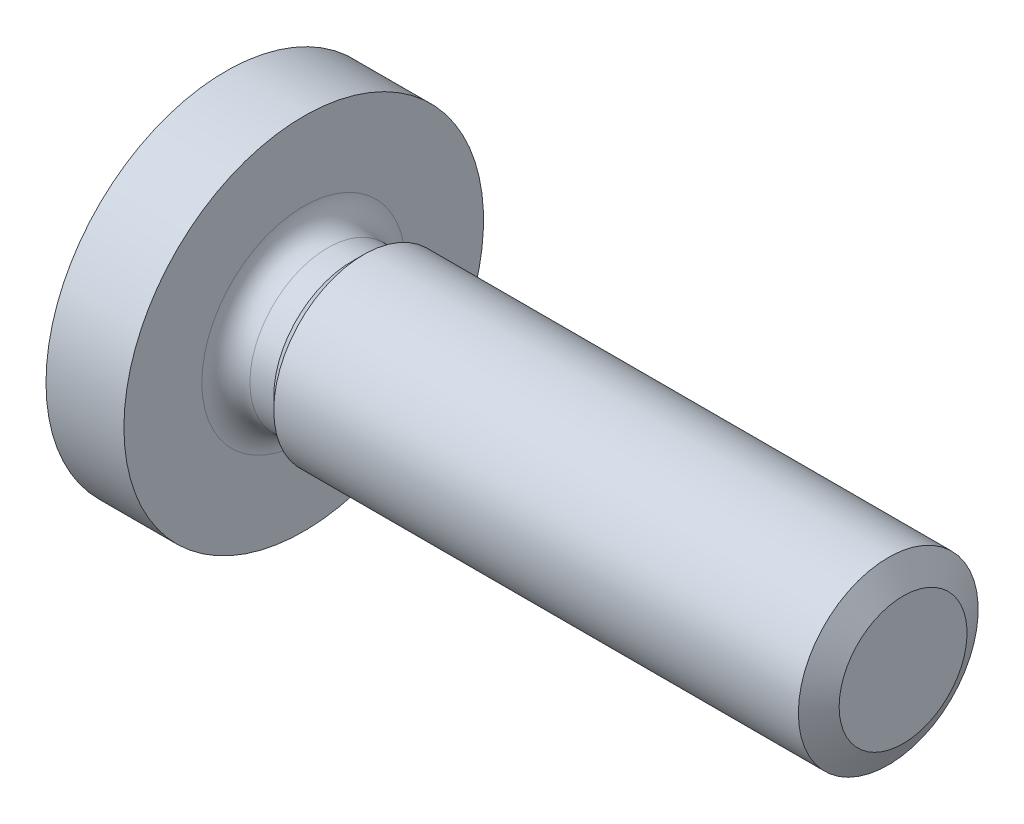
ISO-10303-21;
HEADER;
FILE_DESCRIPTION(('STEP AP214'),'2;1');
FILE_NAME('part.step','',(''),(''),'','','');
FILE_SCHEMA(('AUTOMOTIVE_DESIGN { 1 0 10303 214 1 1 1 1 }'));
ENDSEC;
DATA;
#1=APPLICATION_CONTEXT('core data for automotive mechanical design processes');
#2=APPLICATION_PROTOCOL_DEFINITION('international standard','automotive_design',2000,#1);
#3=PRODUCT_CONTEXT('',#1,'mechanical');
#4=PRODUCT('Part','Part','',(#3));
#5=PRODUCT_RELATED_PRODUCT_CATEGORY('part','',(#4));
#6=PRODUCT_DEFINITION_FORMATION('','',#4);
#7=PRODUCT_DEFINITION_CONTEXT('part definition',#1,'design');
#8=PRODUCT_DEFINITION('design','',#6,#7);
#9=PRODUCT_DEFINITION_SHAPE('','',#8);
#10=(LENGTH_UNIT() NAMED_UNIT(*) SI_UNIT(.MILLI.,.METRE.));
#11=(NAMED_UNIT(*) PLANE_ANGLE_UNIT() SI_UNIT($,.RADIAN.));
#12=(NAMED_UNIT(*) SI_UNIT($,.STERADIAN.) SOLID_ANGLE_UNIT());
#13=UNCERTAINTY_MEASURE_WITH_UNIT(LENGTH_MEASURE(1.E-05),#10,'distance_accuracy_value','');
#14=(GEOMETRIC_REPRESENTATION_CONTEXT(3) GLOBAL_UNCERTAINTY_ASSIGNED_CONTEXT((#13)) GLOBAL_UNIT_ASSIGNED_CONTEXT((#10,
#11,#12)) REPRESENTATION_CONTEXT('',''));
#15=CARTESIAN_POINT('',(0.,0.,0.));
#16=DIRECTION('',(0.,0.,1.));
#17=DIRECTION('',(1.,0.,0.));
#18=AXIS2_PLACEMENT_3D('',#15,#16,#17);
#19=CARTESIAN_POINT('',(3.6,0.,0.));
#20=DIRECTION('',(0.137568371274688,0.,-0.990492273177751));
#21=DIRECTION('',(-0.990492273177752,0.,-0.137568371274688));
#22=AXIS2_PLACEMENT_3D('',#19,#20,#21);
#23=PLANE('',#22);
#24=DIRECTION('',(-0.71838544707728,-0.688452720115727,-0.0997757565385112));
#25=VECTOR('',#24,1.);
#26=CARTESIAN_POINT('',(3.6,0.,0.));
#27=LINE('',#26,#25);
#28=CARTESIAN_POINT('',(3.6,0.,0.));
#29=VERTEX_POINT('',#28);
#30=CARTESIAN_POINT('',(0.470296179970065,-2.99929949419535,-0.434681086115269));
#31=VERTEX_POINT('',#30);
#32=EDGE_CURVE('E160',#29,#31,#27,.T.);
#33=ORIENTED_EDGE('',*,*,#32,.F.);
#34=DIRECTION('',(-0.981250680241291,-0.136284816700179,-0.136284816700179));
#35=VECTOR('',#34,1.);
#36=CARTESIAN_POINT('',(3.6,0.,0.));
#37=LINE('',#36,#35);
#38=CARTESIAN_POINT('',(0.0246887531766358,-0.496571006503243,-0.496571006503246));
#39=VERTEX_POINT('',#38);
#40=EDGE_CURVE('E121',#29,#39,#37,.T.);
#41=ORIENTED_EDGE('',*,*,#40,.T.);
#42=CARTESIAN_POINT('',(9.87887963663891,0.,0.872066616199849));
#43=DIRECTION('',(0.137568371274688,0.,-0.990492273177751));
#44=DIRECTION('',(-0.990492273177752,0.,-0.137568371274688));
#45=AXIS2_PLACEMENT_3D('',#42,#43,#44);
#46=CIRCLE('',#45,9.96116608005755);
#47=EDGE_CURVE('E134',#31,#39,#46,.T.);
#48=ORIENTED_EDGE('',*,*,#47,.F.);
#49=EDGE_LOOP('',(#33,#41,#48));
#50=FACE_BOUND('',#49,.T.);
#51=ADVANCED_FACE('F41',(#50),#23,.F.);
#52=CARTESIAN_POINT('',(3.6,0.,0.));
#53=DIRECTION('',(0.137568371274688,0.,0.990492273177751));
#54=DIRECTION('',(0.990492273177752,0.,-0.137568371274688));
#55=AXIS2_PLACEMENT_3D('',#52,#53,#54);
#56=PLANE('',#55);
#57=CARTESIAN_POINT('',(9.87887963663891,0.,-0.872066616199848));
#58=DIRECTION('',(0.137568371274688,0.,0.990492273177751));
#59=DIRECTION('',(0.990492273177752,0.,-0.137568371274688));
#60=AXIS2_PLACEMENT_3D('',#57,#58,#59);
#61=CIRCLE('',#60,9.96116608005755);
#62=CARTESIAN_POINT('',(0.0246887531766358,-0.496571006503248,0.496571006503245));
#63=VERTEX_POINT('',#62);
#64=CARTESIAN_POINT('',(0.470296179970068,-2.99929949419536,0.434681086115269));
#65=VERTEX_POINT('',#64);
#66=EDGE_CURVE('E64',#63,#65,#61,.T.);
#67=ORIENTED_EDGE('',*,*,#66,.F.);
#68=DIRECTION('',(0.981250680241291,0.13628481670018,-0.136284816700179));
#69=VECTOR('',#68,1.);
#70=CARTESIAN_POINT('',(3.6,0.,0.));
#71=LINE('',#70,#69);
#72=EDGE_CURVE('E11',#63,#29,#71,.T.);
#73=ORIENTED_EDGE('',*,*,#72,.T.);
#74=DIRECTION('',(-0.71838544707728,-0.688452720115727,0.0997757565385112));
#75=VECTOR('',#74,1.);
#76=CARTESIAN_POINT('',(3.6,0.,0.));
#77=LINE('',#76,#75);
#78=EDGE_CURVE('E161',#29,#65,#77,.T.);
#79=ORIENTED_EDGE('',*,*,#78,.T.);
#80=EDGE_LOOP('',(#67,#73,#79));
#81=FACE_BOUND('',#80,.T.);
#82=ADVANCED_FACE('F176',(#81),#56,.F.);
#83=CARTESIAN_POINT('',(-1.33175770411172,0.,0.));
#84=DIRECTION('',(-1.,0.,0.));
#85=DIRECTION('',(0.,0.,1.));
#86=AXIS2_PLACEMENT_3D('',#83,#84,#85);
#87=CYLINDRICAL_SURFACE('',#86,3.);
#88=CARTESIAN_POINT('',(6.6,0.,0.));
#89=DIRECTION('',(-1.,0.,0.));
#90=DIRECTION('',(0.,0.,1.));
#91=AXIS2_PLACEMENT_3D('',#88,#89,#90);
#92=CIRCLE('',#91,3.);
#93=CARTESIAN_POINT('',(6.6,0.,3.));
#94=VERTEX_POINT('',#93);
#95=EDGE_CURVE('E197',#94,#94,#92,.T.);
#96=ORIENTED_EDGE('',*,*,#95,.F.);
#97=EDGE_LOOP('',(#96));
#98=FACE_BOUND('',#97,.T.);
#99=CARTESIAN_POINT('',(24.1054160057444,0.,0.));
#100=DIRECTION('',(-1.,0.,0.));
#101=DIRECTION('',(0.,0.,1.));
#102=AXIS2_PLACEMENT_3D('',#99,#100,#101);
#103=CIRCLE('',#102,3.00000000000001);
#104=CARTESIAN_POINT('',(24.1054160057444,0.,3.00000000000001));
#105=VERTEX_POINT('',#104);
#106=EDGE_CURVE('E194',#105,#105,#103,.T.);
#107=ORIENTED_EDGE('',*,*,#106,.T.);
#108=EDGE_LOOP('',(#107));
#109=FACE_BOUND('',#108,.T.);
#110=ADVANCED_FACE('F241',(#98,#109),#87,.T.);
#111=CARTESIAN_POINT('',(10.,0.,0.));
#112=DIRECTION('',(-1.,0.,0.));
#113=DIRECTION('',(0.,1.,0.));
#114=AXIS2_PLACEMENT_3D('',#111,#112,#113);
#115=SPHERICAL_SURFACE('',#114,10.);
#116=CARTESIAN_POINT('',(6.93610859728507,0.,-3.19710407239819));
#117=DIRECTION('',(0.691905363235615,0.,0.721988205115424));
#118=DIRECTION('',(0.721988205115424,0.,-0.691905363235615));
#119=AXIS2_PLACEMENT_3D('',#116,#117,#118);
#120=CIRCLE('',#119,8.96610813132568);
#121=CARTESIAN_POINT('',(0.470296179970068,0.434681086115258,2.99929949419536));
#122=VERTEX_POINT('',#121);
#123=CARTESIAN_POINT('',(0.470296179970064,-0.434681086115279,2.99929949419535));
#124=VERTEX_POINT('',#123);
#125=EDGE_CURVE('E127',#122,#124,#120,.T.);
#126=ORIENTED_EDGE('',*,*,#125,.T.);
#127=CARTESIAN_POINT('',(9.87887963663891,0.872066616199849,0.));
#128=DIRECTION('',(0.137568371274688,-0.990492273177751,0.));
#129=DIRECTION('',(0.990492273177752,0.137568371274688,0.));
#130=AXIS2_PLACEMENT_3D('',#127,#128,#129);
#131=CIRCLE('',#130,9.96116608005755);
#132=EDGE_CURVE('E143',#124,#63,#131,.T.);
#133=ORIENTED_EDGE('',*,*,#132,.T.);
#134=ORIENTED_EDGE('',*,*,#66,.T.);
#135=CARTESIAN_POINT('',(6.93610859728507,3.19710407239819,0.));
#136=DIRECTION('',(0.691905363235615,-0.721988205115424,0.));
#137=DIRECTION('',(0.721988205115424,0.691905363235615,0.));
#138=AXIS2_PLACEMENT_3D('',#135,#136,#137);
#139=CIRCLE('',#138,8.96610813132568);
#140=EDGE_CURVE('E173',#65,#31,#139,.T.);
#141=ORIENTED_EDGE('',*,*,#140,.T.);
#142=ORIENTED_EDGE('',*,*,#47,.T.);
#143=CARTESIAN_POINT('',(0.470296179970064,-0.434681086115258,-2.99929949419535));
#144=VERTEX_POINT('',#143);
#145=EDGE_CURVE('E123',#39,#144,#131,.T.);
#146=ORIENTED_EDGE('',*,*,#145,.T.);
#147=CARTESIAN_POINT('',(6.93610859728507,0.,3.19710407239819));
#148=DIRECTION('',(0.691905363235615,0.,-0.721988205115424));
#149=DIRECTION('',(-0.721988205115424,0.,-0.691905363235615));
#150=AXIS2_PLACEMENT_3D('',#147,#148,#149);
#151=CIRCLE('',#150,8.96610813132568);
#152=CARTESIAN_POINT('',(0.470296179970066,0.434681086115279,-2.99929949419535));
#153=VERTEX_POINT('',#152);
#154=EDGE_CURVE('E115',#144,#153,#151,.T.);
#155=ORIENTED_EDGE('',*,*,#154,.T.);
#156=CARTESIAN_POINT('',(9.87887963663891,-0.872066616199848,0.));
#157=DIRECTION('',(0.137568371274688,0.990492273177751,0.));
#158=DIRECTION('',(-0.990492273177752,0.137568371274688,0.));
#159=AXIS2_PLACEMENT_3D('',#156,#157,#158);
#160=CIRCLE('',#159,9.96116608005755);
#161=CARTESIAN_POINT('',(0.024688753176634,0.496571006503247,-0.496571006503246));
#162=VERTEX_POINT('',#161);
#163=EDGE_CURVE('E106',#153,#162,#160,.T.);
#164=ORIENTED_EDGE('',*,*,#163,.T.);
#165=CARTESIAN_POINT('',(0.470296179970065,2.99929949419535,-0.434681086115269));
#166=VERTEX_POINT('',#165);
#167=EDGE_CURVE('E151',#162,#166,#46,.T.);
#168=ORIENTED_EDGE('',*,*,#167,.T.);
#169=CARTESIAN_POINT('',(6.93610859728507,-3.19710407239819,0.));
#170=DIRECTION('',(0.691905363235615,0.721988205115424,0.));
#171=DIRECTION('',(-0.721988205115424,0.691905363235615,0.));
#172=AXIS2_PLACEMENT_3D('',#169,#170,#171);
#173=CIRCLE('',#172,8.96610813132568);
#174=CARTESIAN_POINT('',(0.470296179970068,2.99929949419536,0.434681086115269));
#175=VERTEX_POINT('',#174);
#176=EDGE_CURVE('E164',#166,#175,#173,.T.);
#177=ORIENTED_EDGE('',*,*,#176,.T.);
#178=CARTESIAN_POINT('',(0.0246887531766358,0.496571006503243,0.496571006503246));
#179=VERTEX_POINT('',#178);
#180=EDGE_CURVE('E156',#175,#179,#61,.T.);
#181=ORIENTED_EDGE('',*,*,#180,.T.);
#182=EDGE_CURVE('E56',#179,#122,#160,.T.);
#183=ORIENTED_EDGE('',*,*,#182,.T.);
#184=EDGE_LOOP('',(#126,#133,#134,#141,#142,#146,#155,#164,#168,#177,#181,#183));
#185=FACE_BOUND('',#184,.T.);
#186=CARTESIAN_POINT('',(2.,0.,0.));
#187=DIRECTION('',(-1.,0.,0.));
#188=DIRECTION('',(0.,0.,1.));
#189=AXIS2_PLACEMENT_3D('',#186,#187,#188);
#190=CIRCLE('',#189,6.);
#191=CARTESIAN_POINT('',(2.,0.,6.));
#192=VERTEX_POINT('',#191);
#193=EDGE_CURVE('E177',#192,#192,#190,.T.);
#194=ORIENTED_EDGE('',*,*,#193,.T.);
#195=EDGE_LOOP('',(#194));
#196=FACE_BOUND('',#195,.T.);
#197=ADVANCED_FACE('F43',(#185,#196),#115,.T.);
#198=CARTESIAN_POINT('',(-1.33175770411172,0.,0.));
#199=DIRECTION('',(-1.,0.,0.));
#200=DIRECTION('',(0.,0.,1.));
#201=AXIS2_PLACEMENT_3D('',#198,#199,#200);
#202=CYLINDRICAL_SURFACE('',#201,6.);
#203=ORIENTED_EDGE('',*,*,#193,.F.);
#204=EDGE_LOOP('',(#203));
#205=FACE_BOUND('',#204,.T.);
#206=CARTESIAN_POINT('',(4.6,0.,0.));
#207=DIRECTION('',(-1.,0.,0.));
#208=DIRECTION('',(0.,0.,1.));
#209=AXIS2_PLACEMENT_3D('',#206,#207,#208);
#210=CIRCLE('',#209,6.);
#211=CARTESIAN_POINT('',(4.6,0.,6.));
#212=VERTEX_POINT('',#211);
#213=EDGE_CURVE('E180',#212,#212,#210,.T.);
#214=ORIENTED_EDGE('',*,*,#213,.T.);
#215=EDGE_LOOP('',(#214));
#216=FACE_BOUND('',#215,.T.);
#217=ADVANCED_FACE('F214',(#205,#216),#202,.T.);
#218=CARTESIAN_POINT('',(4.6,3.4,0.));
#219=DIRECTION('',(-1.,0.,0.));
#220=DIRECTION('',(0.,0.,1.));
#221=AXIS2_PLACEMENT_3D('',#218,#219,#220);
#222=PLANE('',#221);
#223=ORIENTED_EDGE('',*,*,#213,.F.);
#224=EDGE_LOOP('',(#223));
#225=FACE_BOUND('',#224,.T.);
#226=CARTESIAN_POINT('',(4.6,0.,0.));
#227=DIRECTION('',(-1.,0.,0.));
#228=DIRECTION('',(0.,0.,1.));
#229=AXIS2_PLACEMENT_3D('',#226,#227,#228);
#230=CIRCLE('',#229,3.4);
#231=CARTESIAN_POINT('',(4.6,0.,3.4));
#232=VERTEX_POINT('',#231);
#233=EDGE_CURVE('E206',#232,#232,#230,.T.);
#234=ORIENTED_EDGE('',*,*,#233,.T.);
#235=EDGE_LOOP('',(#234));
#236=FACE_BOUND('',#235,.T.);
#237=ADVANCED_FACE('F216',(#225,#236),#222,.F.);
#238=CARTESIAN_POINT('',(5.402,0.,0.));
#239=DIRECTION('',(-1.,0.,0.));
#240=DIRECTION('',(0.,0.,1.));
#241=AXIS2_PLACEMENT_3D('',#238,#239,#240);
#242=TOROIDAL_SURFACE('',#241,3.4,0.801999999999999);
#243=ORIENTED_EDGE('',*,*,#233,.F.);
#244=EDGE_LOOP('',(#243));
#245=FACE_BOUND('',#244,.T.);
#246=CARTESIAN_POINT('',(5.402,0.,0.));
#247=DIRECTION('',(-1.,0.,0.));
#248=DIRECTION('',(0.,0.,1.));
#249=AXIS2_PLACEMENT_3D('',#246,#247,#248);
#250=CIRCLE('',#249,2.598);
#251=CARTESIAN_POINT('',(5.402,0.,2.598));
#252=VERTEX_POINT('',#251);
#253=EDGE_CURVE('E203',#252,#252,#250,.T.);
#254=ORIENTED_EDGE('',*,*,#253,.T.);
#255=EDGE_LOOP('',(#254));
#256=FACE_BOUND('',#255,.T.);
#257=ADVANCED_FACE('F219',(#245,#256),#242,.F.);
#258=CARTESIAN_POINT('',(-1.33175770411172,0.,0.));
#259=DIRECTION('',(-1.,0.,0.));
#260=DIRECTION('',(0.,0.,1.));
#261=AXIS2_PLACEMENT_3D('',#258,#259,#260);
#262=CYLINDRICAL_SURFACE('',#261,2.598);
#263=ORIENTED_EDGE('',*,*,#253,.F.);
#264=EDGE_LOOP('',(#263));
#265=FACE_BOUND('',#264,.T.);
#266=CARTESIAN_POINT('',(6.198,0.,0.));
#267=DIRECTION('',(-1.,0.,0.));
#268=DIRECTION('',(0.,0.,1.));
#269=AXIS2_PLACEMENT_3D('',#266,#267,#268);
#270=CIRCLE('',#269,2.598);
#271=CARTESIAN_POINT('',(6.198,0.,2.598));
#272=VERTEX_POINT('',#271);
#273=EDGE_CURVE('E200',#272,#272,#270,.T.);
#274=ORIENTED_EDGE('',*,*,#273,.T.);
#275=EDGE_LOOP('',(#274));
#276=FACE_BOUND('',#275,.T.);
#277=ADVANCED_FACE('F225',(#265,#276),#262,.T.);
#278=CARTESIAN_POINT('',(6.6,0.,0.));
#279=DIRECTION('',(1.,0.,0.));
#280=DIRECTION('',(0.,0.,-1.));
#281=AXIS2_PLACEMENT_3D('',#278,#279,#280);
#282=CONICAL_SURFACE('',#281,3.,0.785398163397445);
#283=ORIENTED_EDGE('',*,*,#273,.F.);
#284=EDGE_LOOP('',(#283));
#285=FACE_BOUND('',#284,.T.);
#286=ORIENTED_EDGE('',*,*,#95,.T.);
#287=EDGE_LOOP('',(#286));
#288=FACE_BOUND('',#287,.T.);
#289=ADVANCED_FACE('F231',(#285,#288),#282,.T.);
#290=CARTESIAN_POINT('',(24.1054160057444,0.,0.));
#291=DIRECTION('',(-1.,0.,0.));
#292=DIRECTION('',(0.,0.,1.));
#293=AXIS2_PLACEMENT_3D('',#290,#291,#292);
#294=CONICAL_SURFACE('',#293,3.00000000000001,1.051888018553);
#295=CARTESIAN_POINT('',(24.6,0.,0.));
#296=DIRECTION('',(-1.,0.,0.));
#297=DIRECTION('',(0.,0.,1.));
#298=AXIS2_PLACEMENT_3D('',#295,#296,#297);
#299=CIRCLE('',#298,2.134);
#300=CARTESIAN_POINT('',(24.6,0.,2.134));
#301=VERTEX_POINT('',#300);
#302=EDGE_CURVE('E165',#301,#301,#299,.T.);
#303=ORIENTED_EDGE('',*,*,#302,.T.);
#304=EDGE_LOOP('',(#303));
#305=FACE_BOUND('',#304,.T.);
#306=ORIENTED_EDGE('',*,*,#106,.F.);
#307=EDGE_LOOP('',(#306));
#308=FACE_BOUND('',#307,.T.);
#309=ADVANCED_FACE('F237',(#305,#308),#294,.T.);
#310=CARTESIAN_POINT('',(24.6,0.,0.));
#311=DIRECTION('',(-1.,0.,0.));
#312=DIRECTION('',(0.,0.,1.));
#313=AXIS2_PLACEMENT_3D('',#310,#311,#312);
#314=PLANE('',#313);
#315=ORIENTED_EDGE('',*,*,#302,.F.);
#316=EDGE_LOOP('',(#315));
#317=FACE_BOUND('',#316,.T.);
#318=ADVANCED_FACE('F248',(#317),#314,.F.);
#319=ORIENTED_EDGE('',*,*,#167,.F.);
#320=DIRECTION('',(0.981250680241291,-0.13628481670018,0.136284816700179));
#321=VECTOR('',#320,1.);
#322=CARTESIAN_POINT('',(3.6,0.,0.));
#323=LINE('',#322,#321);
#324=EDGE_CURVE('E104',#162,#29,#323,.T.);
#325=ORIENTED_EDGE('',*,*,#324,.T.);
#326=DIRECTION('',(-0.71838544707728,0.688452720115727,-0.0997757565385112));
#327=VECTOR('',#326,1.);
#328=CARTESIAN_POINT('',(3.6,0.,0.));
#329=LINE('',#328,#327);
#330=EDGE_CURVE('E150',#29,#166,#329,.T.);
#331=ORIENTED_EDGE('',*,*,#330,.T.);
#332=EDGE_LOOP('',(#319,#325,#331));
#333=FACE_BOUND('',#332,.T.);
#334=ADVANCED_FACE('F148',(#333),#23,.F.);
#335=CARTESIAN_POINT('',(0.,3.45,-0.5));
#336=DIRECTION('',(0.691905363235615,0.721988205115424,0.));
#337=DIRECTION('',(-0.721988205115424,0.691905363235615,0.));
#338=AXIS2_PLACEMENT_3D('',#335,#336,#337);
#339=PLANE('',#338);
#340=ORIENTED_EDGE('',*,*,#330,.F.);
#341=DIRECTION('',(-0.71838544707728,0.688452720115727,0.0997757565385111));
#342=VECTOR('',#341,1.);
#343=CARTESIAN_POINT('',(3.6,0.,0.));
#344=LINE('',#343,#342);
#345=EDGE_CURVE('E154',#29,#175,#344,.T.);
#346=ORIENTED_EDGE('',*,*,#345,.T.);
#347=ORIENTED_EDGE('',*,*,#176,.F.);
#348=EDGE_LOOP('',(#340,#346,#347));
#349=FACE_BOUND('',#348,.T.);
#350=ADVANCED_FACE('F163',(#349),#339,.F.);
#351=CARTESIAN_POINT('',(0.,-3.45,0.5));
#352=DIRECTION('',(0.691905363235615,-0.721988205115424,0.));
#353=DIRECTION('',(0.721988205115424,0.691905363235615,0.));
#354=AXIS2_PLACEMENT_3D('',#351,#352,#353);
#355=PLANE('',#354);
#356=ORIENTED_EDGE('',*,*,#78,.F.);
#357=ORIENTED_EDGE('',*,*,#32,.T.);
#358=ORIENTED_EDGE('',*,*,#140,.F.);
#359=EDGE_LOOP('',(#356,#357,#358));
#360=FACE_BOUND('',#359,.T.);
#361=ADVANCED_FACE('F172',(#360),#355,.F.);
#362=ORIENTED_EDGE('',*,*,#345,.F.);
#363=DIRECTION('',(-0.981250680241291,0.136284816700179,0.136284816700179));
#364=VECTOR('',#363,1.);
#365=CARTESIAN_POINT('',(3.6,0.,0.));
#366=LINE('',#365,#364);
#367=EDGE_CURVE('E49',#29,#179,#366,.T.);
#368=ORIENTED_EDGE('',*,*,#367,.T.);
#369=ORIENTED_EDGE('',*,*,#180,.F.);
#370=EDGE_LOOP('',(#362,#368,#369));
#371=FACE_BOUND('',#370,.T.);
#372=ADVANCED_FACE('F155',(#371),#56,.F.);
#373=CARTESIAN_POINT('',(3.6,0.,0.));
#374=DIRECTION('',(0.137568371274688,-0.990492273177751,0.));
#375=DIRECTION('',(-0.990492273177752,-0.137568371274688,0.));
#376=AXIS2_PLACEMENT_3D('',#373,#374,#375);
#377=PLANE('',#376);
#378=DIRECTION('',(-0.71838544707728,-0.0997757565385136,0.688452720115727));
#379=VECTOR('',#378,1.);
#380=CARTESIAN_POINT('',(3.6,0.,0.));
#381=LINE('',#380,#379);
#382=EDGE_CURVE('E118',#29,#124,#381,.T.);
#383=ORIENTED_EDGE('',*,*,#382,.F.);
#384=ORIENTED_EDGE('',*,*,#72,.F.);
#385=ORIENTED_EDGE('',*,*,#132,.F.);
#386=EDGE_LOOP('',(#383,#384,#385));
#387=FACE_BOUND('',#386,.T.);
#388=ADVANCED_FACE('F142',(#387),#377,.F.);
#389=CARTESIAN_POINT('',(3.6,0.,0.));
#390=DIRECTION('',(0.137568371274688,0.990492273177751,0.));
#391=DIRECTION('',(0.990492273177752,-0.137568371274688,0.));
#392=AXIS2_PLACEMENT_3D('',#389,#390,#391);
#393=PLANE('',#392);
#394=ORIENTED_EDGE('',*,*,#367,.F.);
#395=DIRECTION('',(-0.71838544707728,0.0997757565385087,0.688452720115727));
#396=VECTOR('',#395,1.);
#397=CARTESIAN_POINT('',(3.6,0.,0.));
#398=LINE('',#397,#396);
#399=EDGE_CURVE('E109',#29,#122,#398,.T.);
#400=ORIENTED_EDGE('',*,*,#399,.T.);
#401=ORIENTED_EDGE('',*,*,#182,.F.);
#402=EDGE_LOOP('',(#394,#400,#401));
#403=FACE_BOUND('',#402,.T.);
#404=ADVANCED_FACE('F130',(#403),#393,.F.);
#405=CARTESIAN_POINT('',(0.,-0.500000000000012,3.45));
#406=DIRECTION('',(0.691905363235615,0.,0.721988205115424));
#407=DIRECTION('',(-0.721988205115424,0.,0.691905363235615));
#408=AXIS2_PLACEMENT_3D('',#405,#406,#407);
#409=PLANE('',#408);
#410=ORIENTED_EDGE('',*,*,#399,.F.);
#411=ORIENTED_EDGE('',*,*,#382,.T.);
#412=ORIENTED_EDGE('',*,*,#125,.F.);
#413=EDGE_LOOP('',(#410,#411,#412));
#414=FACE_BOUND('',#413,.T.);
#415=ADVANCED_FACE('F138',(#414),#409,.F.);
#416=ORIENTED_EDGE('',*,*,#40,.F.);
#417=DIRECTION('',(-0.71838544707728,-0.0997757565385088,-0.688452720115727));
#418=VECTOR('',#417,1.);
#419=CARTESIAN_POINT('',(3.6,0.,0.));
#420=LINE('',#419,#418);
#421=EDGE_CURVE('E112',#29,#144,#420,.T.);
#422=ORIENTED_EDGE('',*,*,#421,.T.);
#423=ORIENTED_EDGE('',*,*,#145,.F.);
#424=EDGE_LOOP('',(#416,#422,#423));
#425=FACE_BOUND('',#424,.T.);
#426=ADVANCED_FACE('F122',(#425),#377,.F.);
#427=CARTESIAN_POINT('',(0.,0.500000000000012,-3.45));
#428=DIRECTION('',(0.691905363235615,0.,-0.721988205115424));
#429=DIRECTION('',(0.721988205115424,0.,0.691905363235615));
#430=AXIS2_PLACEMENT_3D('',#427,#428,#429);
#431=PLANE('',#430);
#432=ORIENTED_EDGE('',*,*,#421,.F.);
#433=DIRECTION('',(-0.71838544707728,0.0997757565385136,-0.688452720115727));
#434=VECTOR('',#433,1.);
#435=CARTESIAN_POINT('',(3.6,0.,0.));
#436=LINE('',#435,#434);
#437=EDGE_CURVE('E100',#29,#153,#436,.T.);
#438=ORIENTED_EDGE('',*,*,#437,.T.);
#439=ORIENTED_EDGE('',*,*,#154,.F.);
#440=EDGE_LOOP('',(#432,#438,#439));
#441=FACE_BOUND('',#440,.T.);
#442=ADVANCED_FACE('F114',(#441),#431,.F.);
#443=ORIENTED_EDGE('',*,*,#437,.F.);
#444=ORIENTED_EDGE('',*,*,#324,.F.);
#445=ORIENTED_EDGE('',*,*,#163,.F.);
#446=EDGE_LOOP('',(#443,#444,#445));
#447=FACE_BOUND('',#446,.T.);
#448=ADVANCED_FACE('F102',(#447),#393,.F.);
#449=CLOSED_SHELL('',(#51,#82,#110,#197,#217,#237,#257,#277,#289,#309,#318,#334,#350,#361,#372,
#388,#404,#415,#426,#442,#448));
#450=MANIFOLD_SOLID_BREP('B2',#449);
#451=ADVANCED_BREP_SHAPE_REPRESENTATION('',(#18,#450),#14);
#452=SHAPE_DEFINITION_REPRESENTATION(#9,#451);
ENDSEC;
END-ISO-10303-21;
